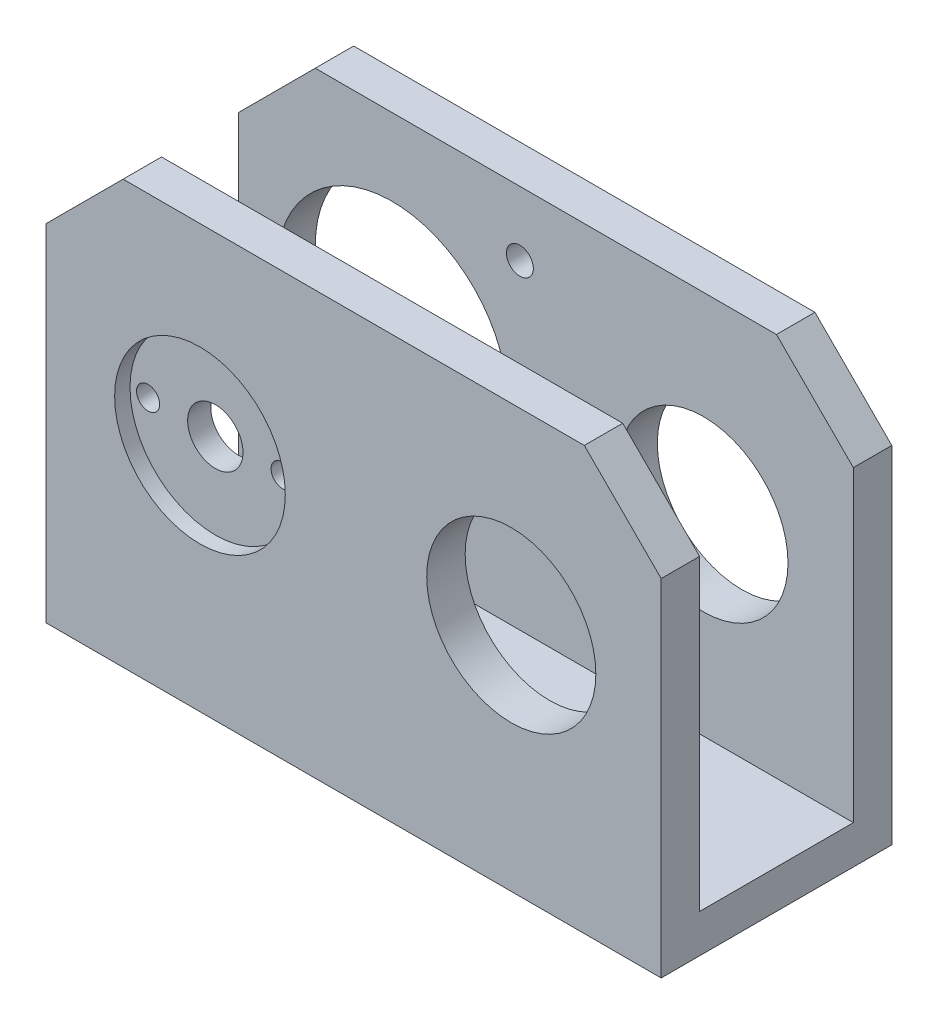
ISO-10303-21;
HEADER;
FILE_DESCRIPTION(('STEP AP214'),'2;1');
FILE_NAME('part.step','',(''),(''),'','','');
FILE_SCHEMA(('AUTOMOTIVE_DESIGN { 1 0 10303 214 1 1 1 1 }'));
ENDSEC;
DATA;
#1=APPLICATION_CONTEXT('core data for automotive mechanical design processes');
#2=APPLICATION_PROTOCOL_DEFINITION('international standard','automotive_design',2000,#1);
#3=PRODUCT_CONTEXT('',#1,'mechanical');
#4=PRODUCT('Part','Part','',(#3));
#5=PRODUCT_RELATED_PRODUCT_CATEGORY('part','',(#4));
#6=PRODUCT_DEFINITION_FORMATION('','',#4);
#7=PRODUCT_DEFINITION_CONTEXT('part definition',#1,'design');
#8=PRODUCT_DEFINITION('design','',#6,#7);
#9=PRODUCT_DEFINITION_SHAPE('','',#8);
#10=(LENGTH_UNIT() NAMED_UNIT(*) SI_UNIT(.MILLI.,.METRE.));
#11=(NAMED_UNIT(*) PLANE_ANGLE_UNIT() SI_UNIT($,.RADIAN.));
#12=(NAMED_UNIT(*) SI_UNIT($,.STERADIAN.) SOLID_ANGLE_UNIT());
#13=UNCERTAINTY_MEASURE_WITH_UNIT(LENGTH_MEASURE(1.E-05),#10,'distance_accuracy_value','');
#14=(GEOMETRIC_REPRESENTATION_CONTEXT(3) GLOBAL_UNCERTAINTY_ASSIGNED_CONTEXT((#13)) GLOBAL_UNIT_ASSIGNED_CONTEXT((#10,
#11,#12)) REPRESENTATION_CONTEXT('',''));
#15=CARTESIAN_POINT('',(0.,0.,0.));
#16=DIRECTION('',(0.,0.,1.));
#17=DIRECTION('',(1.,0.,0.));
#18=AXIS2_PLACEMENT_3D('',#15,#16,#17);
#19=CARTESIAN_POINT('',(0.,-26.,0.));
#20=DIRECTION('',(0.,1.,0.));
#21=DIRECTION('',(0.,0.,1.));
#22=AXIS2_PLACEMENT_3D('',#19,#20,#21);
#23=PLANE('',#22);
#24=DIRECTION('',(0.,0.,1.));
#25=VECTOR('',#24,1.);
#26=CARTESIAN_POINT('',(-40.,-26.,-25.));
#27=LINE('',#26,#25);
#28=CARTESIAN_POINT('',(-40.,-26.,-20.));
#29=VERTEX_POINT('',#28);
#30=CARTESIAN_POINT('',(-40.,-26.,0.));
#31=VERTEX_POINT('',#30);
#32=EDGE_CURVE('E150',#29,#31,#27,.T.);
#33=ORIENTED_EDGE('',*,*,#32,.F.);
#34=DIRECTION('',(1.,0.,0.));
#35=VECTOR('',#34,1.);
#36=CARTESIAN_POINT('',(-120.,-26.,-20.));
#37=LINE('',#36,#35);
#38=CARTESIAN_POINT('',(-120.,-26.,-20.));
#39=VERTEX_POINT('',#38);
#40=EDGE_CURVE('E135',#39,#29,#37,.T.);
#41=ORIENTED_EDGE('',*,*,#40,.F.);
#42=DIRECTION('',(0.,0.,-1.));
#43=VECTOR('',#42,1.);
#44=CARTESIAN_POINT('',(-120.,-26.,-25.));
#45=LINE('',#44,#43);
#46=CARTESIAN_POINT('',(-120.,-26.,0.));
#47=VERTEX_POINT('',#46);
#48=EDGE_CURVE('E149',#47,#39,#45,.T.);
#49=ORIENTED_EDGE('',*,*,#48,.F.);
#50=DIRECTION('',(1.,0.,0.));
#51=VECTOR('',#50,1.);
#52=CARTESIAN_POINT('',(-120.,-26.,0.));
#53=LINE('',#52,#51);
#54=EDGE_CURVE('E213',#47,#31,#53,.T.);
#55=ORIENTED_EDGE('',*,*,#54,.T.);
#56=EDGE_LOOP('',(#33,#41,#49,#55));
#57=FACE_BOUND('',#56,.T.);
#58=ADVANCED_FACE('F39',(#57),#23,.T.);
#59=CARTESIAN_POINT('',(-100.,-1.,0.));
#60=DIRECTION('',(0.,0.,1.));
#61=DIRECTION('',(1.,0.,0.));
#62=AXIS2_PLACEMENT_3D('',#59,#60,#61);
#63=CYLINDRICAL_SURFACE('',#62,3.6);
#64=CARTESIAN_POINT('',(-100.,-1.,0.));
#65=DIRECTION('',(0.,0.,1.));
#66=DIRECTION('',(1.,0.,0.));
#67=AXIS2_PLACEMENT_3D('',#64,#65,#66);
#68=CIRCLE('',#67,3.6);
#69=CARTESIAN_POINT('',(-96.4,-1.,0.));
#70=VERTEX_POINT('',#69);
#71=EDGE_CURVE('E197',#70,#70,#68,.T.);
#72=ORIENTED_EDGE('',*,*,#71,.F.);
#73=EDGE_LOOP('',(#72));
#74=FACE_BOUND('',#73,.T.);
#75=CARTESIAN_POINT('',(-100.,-1.,3.));
#76=DIRECTION('',(0.,0.,1.));
#77=DIRECTION('',(1.,0.,0.));
#78=AXIS2_PLACEMENT_3D('',#75,#76,#77);
#79=CIRCLE('',#78,3.6);
#80=CARTESIAN_POINT('',(-96.4,-1.,3.));
#81=VERTEX_POINT('',#80);
#82=EDGE_CURVE('E190',#81,#81,#79,.F.);
#83=ORIENTED_EDGE('',*,*,#82,.F.);
#84=EDGE_LOOP('',(#83));
#85=FACE_BOUND('',#84,.T.);
#86=ADVANCED_FACE('F308',(#74,#85),#63,.F.);
#87=CARTESIAN_POINT('',(-91.25,-0.999999999999999,0.));
#88=DIRECTION('',(0.,0.,1.));
#89=DIRECTION('',(1.,0.,0.));
#90=AXIS2_PLACEMENT_3D('',#87,#88,#89);
#91=CYLINDRICAL_SURFACE('',#90,1.5);
#92=CARTESIAN_POINT('',(-91.25,-0.999999999999999,0.));
#93=DIRECTION('',(0.,0.,1.));
#94=DIRECTION('',(1.,0.,0.));
#95=AXIS2_PLACEMENT_3D('',#92,#93,#94);
#96=CIRCLE('',#95,1.5);
#97=CARTESIAN_POINT('',(-89.75,-0.999999999999999,0.));
#98=VERTEX_POINT('',#97);
#99=EDGE_CURVE('E193',#98,#98,#96,.T.);
#100=ORIENTED_EDGE('',*,*,#99,.F.);
#101=EDGE_LOOP('',(#100));
#102=FACE_BOUND('',#101,.T.);
#103=CARTESIAN_POINT('',(-91.25,-0.999999999999999,3.));
#104=DIRECTION('',(0.,0.,1.));
#105=DIRECTION('',(1.,0.,0.));
#106=AXIS2_PLACEMENT_3D('',#103,#104,#105);
#107=CIRCLE('',#106,1.5);
#108=CARTESIAN_POINT('',(-89.75,-0.999999999999999,3.));
#109=VERTEX_POINT('',#108);
#110=EDGE_CURVE('E187',#109,#109,#107,.F.);
#111=ORIENTED_EDGE('',*,*,#110,.F.);
#112=EDGE_LOOP('',(#111));
#113=FACE_BOUND('',#112,.T.);
#114=ADVANCED_FACE('F313',(#102,#113),#91,.F.);
#115=CARTESIAN_POINT('',(-108.75,-1.,0.));
#116=DIRECTION('',(0.,0.,1.));
#117=DIRECTION('',(1.,0.,0.));
#118=AXIS2_PLACEMENT_3D('',#115,#116,#117);
#119=CYLINDRICAL_SURFACE('',#118,1.5);
#120=CARTESIAN_POINT('',(-108.75,-1.,0.));
#121=DIRECTION('',(0.,0.,1.));
#122=DIRECTION('',(1.,0.,0.));
#123=AXIS2_PLACEMENT_3D('',#120,#121,#122);
#124=CIRCLE('',#123,1.5);
#125=CARTESIAN_POINT('',(-107.25,-1.,0.));
#126=VERTEX_POINT('',#125);
#127=EDGE_CURVE('E194',#126,#126,#124,.T.);
#128=ORIENTED_EDGE('',*,*,#127,.F.);
#129=EDGE_LOOP('',(#128));
#130=FACE_BOUND('',#129,.T.);
#131=CARTESIAN_POINT('',(-108.75,-1.,3.));
#132=DIRECTION('',(0.,0.,1.));
#133=DIRECTION('',(1.,0.,0.));
#134=AXIS2_PLACEMENT_3D('',#131,#132,#133);
#135=CIRCLE('',#134,1.5);
#136=CARTESIAN_POINT('',(-107.25,-1.,3.));
#137=VERTEX_POINT('',#136);
#138=EDGE_CURVE('E184',#137,#137,#135,.F.);
#139=ORIENTED_EDGE('',*,*,#138,.F.);
#140=EDGE_LOOP('',(#139));
#141=FACE_BOUND('',#140,.T.);
#142=ADVANCED_FACE('F334',(#130,#141),#119,.F.);
#143=CARTESIAN_POINT('',(-120.,24.,5.));
#144=DIRECTION('',(1.,0.,0.));
#145=DIRECTION('',(0.,0.,-1.));
#146=AXIS2_PLACEMENT_3D('',#143,#144,#145);
#147=PLANE('',#146);
#148=DIRECTION('',(0.,-1.,0.));
#149=VECTOR('',#148,1.);
#150=CARTESIAN_POINT('',(-120.,24.,5.));
#151=LINE('',#150,#149);
#152=CARTESIAN_POINT('',(-120.,14.,5.));
#153=VERTEX_POINT('',#152);
#154=CARTESIAN_POINT('',(-120.,-31.,5.));
#155=VERTEX_POINT('',#154);
#156=EDGE_CURVE('E202',#153,#155,#151,.T.);
#157=ORIENTED_EDGE('',*,*,#156,.F.);
#158=DIRECTION('',(0.,0.,-1.));
#159=VECTOR('',#158,1.);
#160=CARTESIAN_POINT('',(-120.,14.,5.));
#161=LINE('',#160,#159);
#162=CARTESIAN_POINT('',(-120.,14.,0.));
#163=VERTEX_POINT('',#162);
#164=EDGE_CURVE('E228',#153,#163,#161,.T.);
#165=ORIENTED_EDGE('',*,*,#164,.T.);
#166=DIRECTION('',(0.,-1.,0.));
#167=VECTOR('',#166,1.);
#168=CARTESIAN_POINT('',(-120.,24.,0.));
#169=LINE('',#168,#167);
#170=EDGE_CURVE('E157',#163,#47,#169,.T.);
#171=ORIENTED_EDGE('',*,*,#170,.T.);
#172=ORIENTED_EDGE('',*,*,#48,.T.);
#173=DIRECTION('',(0.,-1.,0.));
#174=VECTOR('',#173,1.);
#175=CARTESIAN_POINT('',(-120.,104.156097709407,-20.));
#176=LINE('',#175,#174);
#177=CARTESIAN_POINT('',(-120.,14.,-20.));
#178=VERTEX_POINT('',#177);
#179=EDGE_CURVE('E131',#178,#39,#176,.T.);
#180=ORIENTED_EDGE('',*,*,#179,.F.);
#181=DIRECTION('',(0.,0.,-1.));
#182=VECTOR('',#181,1.);
#183=CARTESIAN_POINT('',(-120.,14.,5.));
#184=LINE('',#183,#182);
#185=CARTESIAN_POINT('',(-120.,14.,-25.));
#186=VERTEX_POINT('',#185);
#187=EDGE_CURVE('E211',#178,#186,#184,.T.);
#188=ORIENTED_EDGE('',*,*,#187,.T.);
#189=DIRECTION('',(0.,1.,0.));
#190=VECTOR('',#189,1.);
#191=CARTESIAN_POINT('',(-120.,-31.,-25.));
#192=LINE('',#191,#190);
#193=CARTESIAN_POINT('',(-120.,-31.,-25.));
#194=VERTEX_POINT('',#193);
#195=EDGE_CURVE('E171',#194,#186,#192,.T.);
#196=ORIENTED_EDGE('',*,*,#195,.F.);
#197=DIRECTION('',(0.,0.,-1.));
#198=VECTOR('',#197,1.);
#199=CARTESIAN_POINT('',(-120.,-31.,-25.));
#200=LINE('',#199,#198);
#201=EDGE_CURVE('E161',#155,#194,#200,.T.);
#202=ORIENTED_EDGE('',*,*,#201,.F.);
#203=EDGE_LOOP('',(#157,#165,#171,#172,#180,#188,#196,#202));
#204=FACE_BOUND('',#203,.T.);
#205=ADVANCED_FACE('F154',(#204),#147,.F.);
#206=CARTESIAN_POINT('',(-40.,24.,5.));
#207=DIRECTION('',(-1.,0.,0.));
#208=DIRECTION('',(0.,-1.,0.));
#209=AXIS2_PLACEMENT_3D('',#206,#207,#208);
#210=PLANE('',#209);
#211=DIRECTION('',(0.,1.,0.));
#212=VECTOR('',#211,1.);
#213=CARTESIAN_POINT('',(-40.,24.,0.));
#214=LINE('',#213,#212);
#215=CARTESIAN_POINT('',(-40.,14.,0.));
#216=VERTEX_POINT('',#215);
#217=EDGE_CURVE('E215',#31,#216,#214,.T.);
#218=ORIENTED_EDGE('',*,*,#217,.T.);
#219=DIRECTION('',(0.,0.,1.));
#220=VECTOR('',#219,1.);
#221=CARTESIAN_POINT('',(-40.,14.,5.));
#222=LINE('',#221,#220);
#223=CARTESIAN_POINT('',(-40.,14.,5.));
#224=VERTEX_POINT('',#223);
#225=EDGE_CURVE('E11',#216,#224,#222,.T.);
#226=ORIENTED_EDGE('',*,*,#225,.T.);
#227=DIRECTION('',(0.,1.,0.));
#228=VECTOR('',#227,1.);
#229=CARTESIAN_POINT('',(-40.,24.,5.));
#230=LINE('',#229,#228);
#231=CARTESIAN_POINT('',(-40.,-31.,5.));
#232=VERTEX_POINT('',#231);
#233=EDGE_CURVE('E204',#232,#224,#230,.T.);
#234=ORIENTED_EDGE('',*,*,#233,.F.);
#235=DIRECTION('',(0.,0.,1.));
#236=VECTOR('',#235,1.);
#237=CARTESIAN_POINT('',(-40.,-31.,-25.));
#238=LINE('',#237,#236);
#239=CARTESIAN_POINT('',(-40.,-31.,-25.));
#240=VERTEX_POINT('',#239);
#241=EDGE_CURVE('E263',#240,#232,#238,.T.);
#242=ORIENTED_EDGE('',*,*,#241,.F.);
#243=DIRECTION('',(0.,1.,0.));
#244=VECTOR('',#243,1.);
#245=CARTESIAN_POINT('',(-40.,-31.,-25.));
#246=LINE('',#245,#244);
#247=CARTESIAN_POINT('',(-40.,14.,-25.));
#248=VERTEX_POINT('',#247);
#249=EDGE_CURVE('E168',#240,#248,#246,.T.);
#250=ORIENTED_EDGE('',*,*,#249,.T.);
#251=DIRECTION('',(0.,0.,1.));
#252=VECTOR('',#251,1.);
#253=CARTESIAN_POINT('',(-40.,14.,5.));
#254=LINE('',#253,#252);
#255=CARTESIAN_POINT('',(-40.,14.,-20.));
#256=VERTEX_POINT('',#255);
#257=EDGE_CURVE('E48',#248,#256,#254,.T.);
#258=ORIENTED_EDGE('',*,*,#257,.T.);
#259=DIRECTION('',(0.,-1.,0.));
#260=VECTOR('',#259,1.);
#261=CARTESIAN_POINT('',(-40.,104.156097709407,-20.));
#262=LINE('',#261,#260);
#263=EDGE_CURVE('E144',#256,#29,#262,.T.);
#264=ORIENTED_EDGE('',*,*,#263,.T.);
#265=ORIENTED_EDGE('',*,*,#32,.T.);
#266=EDGE_LOOP('',(#218,#226,#234,#242,#250,#258,#264,#265));
#267=FACE_BOUND('',#266,.T.);
#268=ADVANCED_FACE('F252',(#267),#210,.F.);
#269=CARTESIAN_POINT('',(-120.,24.,5.));
#270=DIRECTION('',(0.,-1.,0.));
#271=DIRECTION('',(0.,0.,-1.));
#272=AXIS2_PLACEMENT_3D('',#269,#270,#271);
#273=PLANE('',#272);
#274=DIRECTION('',(-1.,0.,0.));
#275=VECTOR('',#274,1.);
#276=CARTESIAN_POINT('',(-120.,24.,0.));
#277=LINE('',#276,#275);
#278=CARTESIAN_POINT('',(-50.,24.,0.));
#279=VERTEX_POINT('',#278);
#280=CARTESIAN_POINT('',(-110.,24.,0.));
#281=VERTEX_POINT('',#280);
#282=EDGE_CURVE('E205',#279,#281,#277,.T.);
#283=ORIENTED_EDGE('',*,*,#282,.T.);
#284=DIRECTION('',(0.,0.,1.));
#285=VECTOR('',#284,1.);
#286=CARTESIAN_POINT('',(-110.,24.,5.));
#287=LINE('',#286,#285);
#288=CARTESIAN_POINT('',(-110.,24.,5.));
#289=VERTEX_POINT('',#288);
#290=EDGE_CURVE('E237',#281,#289,#287,.T.);
#291=ORIENTED_EDGE('',*,*,#290,.T.);
#292=DIRECTION('',(-1.,0.,0.));
#293=VECTOR('',#292,1.);
#294=CARTESIAN_POINT('',(-120.,24.,5.));
#295=LINE('',#294,#293);
#296=CARTESIAN_POINT('',(-50.,24.,5.));
#297=VERTEX_POINT('',#296);
#298=EDGE_CURVE('E208',#297,#289,#295,.T.);
#299=ORIENTED_EDGE('',*,*,#298,.F.);
#300=DIRECTION('',(0.,0.,-1.));
#301=VECTOR('',#300,1.);
#302=CARTESIAN_POINT('',(-50.,24.,5.));
#303=LINE('',#302,#301);
#304=EDGE_CURVE('E234',#297,#279,#303,.T.);
#305=ORIENTED_EDGE('',*,*,#304,.T.);
#306=EDGE_LOOP('',(#283,#291,#299,#305));
#307=FACE_BOUND('',#306,.T.);
#308=ADVANCED_FACE('F284',(#307),#273,.F.);
#309=CARTESIAN_POINT('',(0.,0.,5.));
#310=DIRECTION('',(0.,0.,1.));
#311=DIRECTION('',(1.,0.,0.));
#312=AXIS2_PLACEMENT_3D('',#309,#310,#311);
#313=PLANE('',#312);
#314=CARTESIAN_POINT('',(-59.5,-1.,5.));
#315=DIRECTION('',(0.,0.,1.));
#316=DIRECTION('',(1.,0.,0.));
#317=AXIS2_PLACEMENT_3D('',#314,#315,#316);
#318=CIRCLE('',#317,11.);
#319=CARTESIAN_POINT('',(-48.5,-1.,5.));
#320=VERTEX_POINT('',#319);
#321=EDGE_CURVE('E174',#320,#320,#318,.T.);
#322=ORIENTED_EDGE('',*,*,#321,.F.);
#323=EDGE_LOOP('',(#322));
#324=FACE_BOUND('',#323,.T.);
#325=CARTESIAN_POINT('',(-100.,-1.,5.));
#326=DIRECTION('',(0.,0.,1.));
#327=DIRECTION('',(1.,0.,0.));
#328=AXIS2_PLACEMENT_3D('',#325,#326,#327);
#329=CIRCLE('',#328,11.1);
#330=CARTESIAN_POINT('',(-88.9,-1.,5.));
#331=VERTEX_POINT('',#330);
#332=EDGE_CURVE('E178',#331,#331,#329,.T.);
#333=ORIENTED_EDGE('',*,*,#332,.F.);
#334=EDGE_LOOP('',(#333));
#335=FACE_BOUND('',#334,.T.);
#336=ORIENTED_EDGE('',*,*,#298,.T.);
#337=DIRECTION('',(0.707106781186549,0.707106781186547,0.));
#338=VECTOR('',#337,1.);
#339=CARTESIAN_POINT('',(-66.9999999999998,67.,5.));
#340=LINE('',#339,#338);
#341=EDGE_CURVE('E241',#289,#153,#340,.F.);
#342=ORIENTED_EDGE('',*,*,#341,.T.);
#343=ORIENTED_EDGE('',*,*,#156,.T.);
#344=DIRECTION('',(-1.,0.,0.));
#345=VECTOR('',#344,1.);
#346=CARTESIAN_POINT('',(-120.,-31.,5.));
#347=LINE('',#346,#345);
#348=EDGE_CURVE('E165',#232,#155,#347,.T.);
#349=ORIENTED_EDGE('',*,*,#348,.F.);
#350=ORIENTED_EDGE('',*,*,#233,.T.);
#351=DIRECTION('',(0.707106781186547,-0.707106781186549,0.));
#352=VECTOR('',#351,1.);
#353=CARTESIAN_POINT('',(-13.0000000000001,-13.,5.));
#354=LINE('',#353,#352);
#355=EDGE_CURVE('E239',#224,#297,#354,.F.);
#356=ORIENTED_EDGE('',*,*,#355,.T.);
#357=EDGE_LOOP('',(#336,#342,#343,#349,#350,#356));
#358=FACE_BOUND('',#357,.T.);
#359=ADVANCED_FACE('F277',(#324,#335,#358),#313,.T.);
#360=CARTESIAN_POINT('',(0.,0.,0.));
#361=DIRECTION('',(0.,0.,1.));
#362=DIRECTION('',(1.,0.,0.));
#363=AXIS2_PLACEMENT_3D('',#360,#361,#362);
#364=PLANE('',#363);
#365=CARTESIAN_POINT('',(-59.5,-1.,0.));
#366=DIRECTION('',(0.,0.,1.));
#367=DIRECTION('',(1.,0.,0.));
#368=AXIS2_PLACEMENT_3D('',#365,#366,#367);
#369=CIRCLE('',#368,11.);
#370=CARTESIAN_POINT('',(-48.5,-1.,0.));
#371=VERTEX_POINT('',#370);
#372=EDGE_CURVE('E175',#371,#371,#369,.T.);
#373=ORIENTED_EDGE('',*,*,#372,.T.);
#374=EDGE_LOOP('',(#373));
#375=FACE_BOUND('',#374,.T.);
#376=ORIENTED_EDGE('',*,*,#127,.T.);
#377=EDGE_LOOP('',(#376));
#378=FACE_BOUND('',#377,.T.);
#379=ORIENTED_EDGE('',*,*,#99,.T.);
#380=EDGE_LOOP('',(#379));
#381=FACE_BOUND('',#380,.T.);
#382=ORIENTED_EDGE('',*,*,#71,.T.);
#383=EDGE_LOOP('',(#382));
#384=FACE_BOUND('',#383,.T.);
#385=ORIENTED_EDGE('',*,*,#170,.F.);
#386=DIRECTION('',(-0.707106781186549,-0.707106781186547,0.));
#387=VECTOR('',#386,1.);
#388=CARTESIAN_POINT('',(-120.,14.,0.));
#389=LINE('',#388,#387);
#390=EDGE_CURVE('E232',#163,#281,#389,.F.);
#391=ORIENTED_EDGE('',*,*,#390,.T.);
#392=ORIENTED_EDGE('',*,*,#282,.F.);
#393=DIRECTION('',(-0.707106781186547,0.707106781186549,0.));
#394=VECTOR('',#393,1.);
#395=CARTESIAN_POINT('',(-50.,24.,0.));
#396=LINE('',#395,#394);
#397=EDGE_CURVE('E230',#279,#216,#396,.F.);
#398=ORIENTED_EDGE('',*,*,#397,.T.);
#399=ORIENTED_EDGE('',*,*,#217,.F.);
#400=ORIENTED_EDGE('',*,*,#54,.F.);
#401=EDGE_LOOP('',(#385,#391,#392,#398,#399,#400));
#402=FACE_BOUND('',#401,.T.);
#403=ADVANCED_FACE('F287',(#375,#378,#381,#384,#402),#364,.F.);
#404=CARTESIAN_POINT('',(-100.,-1.,3.));
#405=DIRECTION('',(0.,0.,1.));
#406=DIRECTION('',(1.,0.,0.));
#407=AXIS2_PLACEMENT_3D('',#404,#405,#406);
#408=PLANE('',#407);
#409=CARTESIAN_POINT('',(-100.,-1.,3.));
#410=DIRECTION('',(0.,0.,1.));
#411=DIRECTION('',(1.,0.,0.));
#412=AXIS2_PLACEMENT_3D('',#409,#410,#411);
#413=CIRCLE('',#412,11.1);
#414=CARTESIAN_POINT('',(-88.9,-1.,3.));
#415=VERTEX_POINT('',#414);
#416=EDGE_CURVE('E181',#415,#415,#413,.T.);
#417=ORIENTED_EDGE('',*,*,#416,.T.);
#418=EDGE_LOOP('',(#417));
#419=FACE_BOUND('',#418,.T.);
#420=ORIENTED_EDGE('',*,*,#138,.T.);
#421=EDGE_LOOP('',(#420));
#422=FACE_BOUND('',#421,.T.);
#423=ORIENTED_EDGE('',*,*,#110,.T.);
#424=EDGE_LOOP('',(#423));
#425=FACE_BOUND('',#424,.T.);
#426=ORIENTED_EDGE('',*,*,#82,.T.);
#427=EDGE_LOOP('',(#426));
#428=FACE_BOUND('',#427,.T.);
#429=ADVANCED_FACE('F327',(#419,#422,#425,#428),#408,.T.);
#430=CARTESIAN_POINT('',(-100.,-1.,3.));
#431=DIRECTION('',(0.,0.,1.));
#432=DIRECTION('',(1.,0.,0.));
#433=AXIS2_PLACEMENT_3D('',#430,#431,#432);
#434=CYLINDRICAL_SURFACE('',#433,11.1);
#435=ORIENTED_EDGE('',*,*,#416,.F.);
#436=EDGE_LOOP('',(#435));
#437=FACE_BOUND('',#436,.T.);
#438=ORIENTED_EDGE('',*,*,#332,.T.);
#439=EDGE_LOOP('',(#438));
#440=FACE_BOUND('',#439,.T.);
#441=ADVANCED_FACE('F325',(#437,#440),#434,.F.);
#442=CARTESIAN_POINT('',(-59.5,-1.,0.));
#443=DIRECTION('',(0.,0.,1.));
#444=DIRECTION('',(1.,0.,0.));
#445=AXIS2_PLACEMENT_3D('',#442,#443,#444);
#446=CYLINDRICAL_SURFACE('',#445,11.);
#447=ORIENTED_EDGE('',*,*,#372,.F.);
#448=EDGE_LOOP('',(#447));
#449=FACE_BOUND('',#448,.T.);
#450=ORIENTED_EDGE('',*,*,#321,.T.);
#451=EDGE_LOOP('',(#450));
#452=FACE_BOUND('',#451,.T.);
#453=ADVANCED_FACE('F321',(#449,#452),#446,.F.);
#454=CARTESIAN_POINT('',(-120.,-31.,-25.));
#455=DIRECTION('',(0.,0.,1.));
#456=DIRECTION('',(1.,0.,0.));
#457=AXIS2_PLACEMENT_3D('',#454,#455,#456);
#458=PLANE('',#457);
#459=CARTESIAN_POINT('',(-59.5,-1.,-25.));
#460=DIRECTION('',(0.,0.,1.));
#461=DIRECTION('',(1.,0.,0.));
#462=AXIS2_PLACEMENT_3D('',#459,#460,#461);
#463=CIRCLE('',#462,11.);
#464=CARTESIAN_POINT('',(-48.5,-1.,-25.));
#465=VERTEX_POINT('',#464);
#466=EDGE_CURVE('E226',#465,#465,#463,.T.);
#467=ORIENTED_EDGE('',*,*,#466,.T.);
#468=EDGE_LOOP('',(#467));
#469=FACE_BOUND('',#468,.T.);
#470=CARTESIAN_POINT('',(-116.617009357884,-17.6170093578839,-25.));
#471=DIRECTION('',(0.,0.,-1.));
#472=DIRECTION('',(-1.,0.,0.));
#473=AXIS2_PLACEMENT_3D('',#470,#471,#472);
#474=CIRCLE('',#473,1.75);
#475=CARTESIAN_POINT('',(-118.367009357884,-17.6170093578839,-25.));
#476=VERTEX_POINT('',#475);
#477=EDGE_CURVE('E589',#476,#476,#474,.T.);
#478=ORIENTED_EDGE('',*,*,#477,.F.);
#479=EDGE_LOOP('',(#478));
#480=FACE_BOUND('',#479,.T.);
#481=CARTESIAN_POINT('',(-83.3829906421162,15.6170093578839,-25.));
#482=DIRECTION('',(0.,0.,-1.));
#483=DIRECTION('',(-1.,0.,0.));
#484=AXIS2_PLACEMENT_3D('',#481,#482,#483);
#485=CIRCLE('',#484,1.75);
#486=CARTESIAN_POINT('',(-85.1329906421162,15.6170093578839,-25.));
#487=VERTEX_POINT('',#486);
#488=EDGE_CURVE('E225',#487,#487,#485,.T.);
#489=ORIENTED_EDGE('',*,*,#488,.F.);
#490=EDGE_LOOP('',(#489));
#491=FACE_BOUND('',#490,.T.);
#492=CARTESIAN_POINT('',(-100.,-1.,-25.));
#493=DIRECTION('',(0.,0.,-1.));
#494=DIRECTION('',(-1.,0.,0.));
#495=AXIS2_PLACEMENT_3D('',#492,#493,#494);
#496=CIRCLE('',#495,15.);
#497=CARTESIAN_POINT('',(-115.,-1.,-25.));
#498=VERTEX_POINT('',#497);
#499=EDGE_CURVE('E596',#498,#498,#496,.T.);
#500=ORIENTED_EDGE('',*,*,#499,.F.);
#501=EDGE_LOOP('',(#500));
#502=FACE_BOUND('',#501,.T.);
#503=ORIENTED_EDGE('',*,*,#195,.T.);
#504=DIRECTION('',(-0.707106781186549,-0.707106781186547,0.));
#505=VECTOR('',#504,1.);
#506=CARTESIAN_POINT('',(-120.,14.,-25.));
#507=LINE('',#506,#505);
#508=CARTESIAN_POINT('',(-110.,24.,-25.));
#509=VERTEX_POINT('',#508);
#510=EDGE_CURVE('E245',#186,#509,#507,.F.);
#511=ORIENTED_EDGE('',*,*,#510,.T.);
#512=DIRECTION('',(1.,0.,0.));
#513=VECTOR('',#512,1.);
#514=CARTESIAN_POINT('',(-120.,24.,-25.));
#515=LINE('',#514,#513);
#516=CARTESIAN_POINT('',(-50.0000000000001,24.,-25.));
#517=VERTEX_POINT('',#516);
#518=EDGE_CURVE('E143',#509,#517,#515,.T.);
#519=ORIENTED_EDGE('',*,*,#518,.T.);
#520=DIRECTION('',(-0.707106781186549,0.707106781186546,0.));
#521=VECTOR('',#520,1.);
#522=CARTESIAN_POINT('',(-40.,14.,-25.));
#523=LINE('',#522,#521);
#524=EDGE_CURVE('E243',#517,#248,#523,.F.);
#525=ORIENTED_EDGE('',*,*,#524,.T.);
#526=ORIENTED_EDGE('',*,*,#249,.F.);
#527=DIRECTION('',(1.,0.,0.));
#528=VECTOR('',#527,1.);
#529=CARTESIAN_POINT('',(-120.,-31.,-25.));
#530=LINE('',#529,#528);
#531=EDGE_CURVE('E262',#194,#240,#530,.T.);
#532=ORIENTED_EDGE('',*,*,#531,.F.);
#533=EDGE_LOOP('',(#503,#511,#519,#525,#526,#532));
#534=FACE_BOUND('',#533,.T.);
#535=ADVANCED_FACE('F274',(#469,#480,#491,#502,#534),#458,.F.);
#536=CARTESIAN_POINT('',(0.,-31.,0.));
#537=DIRECTION('',(0.,1.,0.));
#538=DIRECTION('',(0.,0.,1.));
#539=AXIS2_PLACEMENT_3D('',#536,#537,#538);
#540=PLANE('',#539);
#541=ORIENTED_EDGE('',*,*,#201,.T.);
#542=ORIENTED_EDGE('',*,*,#531,.T.);
#543=ORIENTED_EDGE('',*,*,#241,.T.);
#544=ORIENTED_EDGE('',*,*,#348,.T.);
#545=EDGE_LOOP('',(#541,#542,#543,#544));
#546=FACE_BOUND('',#545,.T.);
#547=ADVANCED_FACE('F269',(#546),#540,.F.);
#548=CARTESIAN_POINT('',(-120.,104.156097709407,-20.));
#549=DIRECTION('',(0.,0.,-1.));
#550=DIRECTION('',(-1.,0.,0.));
#551=AXIS2_PLACEMENT_3D('',#548,#549,#550);
#552=PLANE('',#551);
#553=CARTESIAN_POINT('',(-59.5,-1.,-20.));
#554=DIRECTION('',(0.,0.,-1.));
#555=DIRECTION('',(-1.,0.,0.));
#556=AXIS2_PLACEMENT_3D('',#553,#554,#555);
#557=CIRCLE('',#556,11.);
#558=CARTESIAN_POINT('',(-70.5,-1.,-20.));
#559=VERTEX_POINT('',#558);
#560=EDGE_CURVE('E222',#559,#559,#557,.F.);
#561=ORIENTED_EDGE('',*,*,#560,.F.);
#562=EDGE_LOOP('',(#561));
#563=FACE_BOUND('',#562,.T.);
#564=CARTESIAN_POINT('',(-116.617009357884,-17.6170093578839,-20.));
#565=DIRECTION('',(0.,0.,-1.));
#566=DIRECTION('',(-1.,0.,0.));
#567=AXIS2_PLACEMENT_3D('',#564,#565,#566);
#568=CIRCLE('',#567,1.75);
#569=CARTESIAN_POINT('',(-118.367009357884,-17.6170093578839,-20.));
#570=VERTEX_POINT('',#569);
#571=EDGE_CURVE('E592',#570,#570,#568,.F.);
#572=ORIENTED_EDGE('',*,*,#571,.F.);
#573=EDGE_LOOP('',(#572));
#574=FACE_BOUND('',#573,.T.);
#575=CARTESIAN_POINT('',(-83.3829906421162,15.6170093578839,-20.));
#576=DIRECTION('',(0.,0.,-1.));
#577=DIRECTION('',(-1.,0.,0.));
#578=AXIS2_PLACEMENT_3D('',#575,#576,#577);
#579=CIRCLE('',#578,1.75);
#580=CARTESIAN_POINT('',(-85.1329906421162,15.6170093578839,-20.));
#581=VERTEX_POINT('',#580);
#582=EDGE_CURVE('E594',#581,#581,#579,.F.);
#583=ORIENTED_EDGE('',*,*,#582,.F.);
#584=EDGE_LOOP('',(#583));
#585=FACE_BOUND('',#584,.T.);
#586=CARTESIAN_POINT('',(-100.,-1.,-20.));
#587=DIRECTION('',(0.,0.,-1.));
#588=DIRECTION('',(-1.,0.,0.));
#589=AXIS2_PLACEMENT_3D('',#586,#587,#588);
#590=CIRCLE('',#589,15.);
#591=CARTESIAN_POINT('',(-115.,-1.,-20.));
#592=VERTEX_POINT('',#591);
#593=EDGE_CURVE('E151',#592,#592,#590,.F.);
#594=ORIENTED_EDGE('',*,*,#593,.F.);
#595=EDGE_LOOP('',(#594));
#596=FACE_BOUND('',#595,.T.);
#597=DIRECTION('',(-1.,0.,0.));
#598=VECTOR('',#597,1.);
#599=CARTESIAN_POINT('',(-120.,24.,-20.));
#600=LINE('',#599,#598);
#601=CARTESIAN_POINT('',(-50.0000000000001,24.,-20.));
#602=VERTEX_POINT('',#601);
#603=CARTESIAN_POINT('',(-110.,24.,-20.));
#604=VERTEX_POINT('',#603);
#605=EDGE_CURVE('E159',#602,#604,#600,.T.);
#606=ORIENTED_EDGE('',*,*,#605,.T.);
#607=DIRECTION('',(0.707106781186549,0.707106781186547,0.));
#608=VECTOR('',#607,1.);
#609=CARTESIAN_POINT('',(-120.,14.,-20.));
#610=LINE('',#609,#608);
#611=EDGE_CURVE('E138',#604,#178,#610,.F.);
#612=ORIENTED_EDGE('',*,*,#611,.T.);
#613=ORIENTED_EDGE('',*,*,#179,.T.);
#614=ORIENTED_EDGE('',*,*,#40,.T.);
#615=ORIENTED_EDGE('',*,*,#263,.F.);
#616=DIRECTION('',(0.707106781186549,-0.707106781186546,0.));
#617=VECTOR('',#616,1.);
#618=CARTESIAN_POINT('',(-40.,14.,-20.));
#619=LINE('',#618,#617);
#620=EDGE_CURVE('E55',#256,#602,#619,.F.);
#621=ORIENTED_EDGE('',*,*,#620,.T.);
#622=EDGE_LOOP('',(#606,#612,#613,#614,#615,#621));
#623=FACE_BOUND('',#622,.T.);
#624=ADVANCED_FACE('F133',(#563,#574,#585,#596,#623),#552,.F.);
#625=CARTESIAN_POINT('',(-120.,24.,5.));
#626=DIRECTION('',(0.,-1.,0.));
#627=DIRECTION('',(0.,0.,-1.));
#628=AXIS2_PLACEMENT_3D('',#625,#626,#627);
#629=PLANE('',#628);
#630=ORIENTED_EDGE('',*,*,#518,.F.);
#631=DIRECTION('',(0.,0.,1.));
#632=VECTOR('',#631,1.);
#633=CARTESIAN_POINT('',(-110.,24.,5.));
#634=LINE('',#633,#632);
#635=EDGE_CURVE('E63',#509,#604,#634,.T.);
#636=ORIENTED_EDGE('',*,*,#635,.T.);
#637=ORIENTED_EDGE('',*,*,#605,.F.);
#638=DIRECTION('',(0.,0.,-1.));
#639=VECTOR('',#638,1.);
#640=CARTESIAN_POINT('',(-50.0000000000001,24.,5.));
#641=LINE('',#640,#639);
#642=EDGE_CURVE('E247',#602,#517,#641,.T.);
#643=ORIENTED_EDGE('',*,*,#642,.T.);
#644=EDGE_LOOP('',(#630,#636,#637,#643));
#645=FACE_BOUND('',#644,.T.);
#646=ADVANCED_FACE('F399',(#645),#629,.F.);
#647=CARTESIAN_POINT('',(-100.,-1.,5.001));
#648=DIRECTION('',(0.,0.,-1.));
#649=DIRECTION('',(-1.,0.,0.));
#650=AXIS2_PLACEMENT_3D('',#647,#648,#649);
#651=CYLINDRICAL_SURFACE('',#650,15.);
#652=ORIENTED_EDGE('',*,*,#499,.T.);
#653=EDGE_LOOP('',(#652));
#654=FACE_BOUND('',#653,.T.);
#655=ORIENTED_EDGE('',*,*,#593,.T.);
#656=EDGE_LOOP('',(#655));
#657=FACE_BOUND('',#656,.T.);
#658=ADVANCED_FACE('F406',(#654,#657),#651,.F.);
#659=CARTESIAN_POINT('',(-83.3829906421162,15.6170093578839,5.001));
#660=DIRECTION('',(0.,0.,-1.));
#661=DIRECTION('',(-1.,0.,0.));
#662=AXIS2_PLACEMENT_3D('',#659,#660,#661);
#663=CYLINDRICAL_SURFACE('',#662,1.75);
#664=ORIENTED_EDGE('',*,*,#488,.T.);
#665=EDGE_LOOP('',(#664));
#666=FACE_BOUND('',#665,.T.);
#667=ORIENTED_EDGE('',*,*,#582,.T.);
#668=EDGE_LOOP('',(#667));
#669=FACE_BOUND('',#668,.T.);
#670=ADVANCED_FACE('F413',(#666,#669),#663,.F.);
#671=CARTESIAN_POINT('',(-116.617009357884,-17.6170093578839,5.001));
#672=DIRECTION('',(0.,0.,-1.));
#673=DIRECTION('',(-1.,0.,0.));
#674=AXIS2_PLACEMENT_3D('',#671,#672,#673);
#675=CYLINDRICAL_SURFACE('',#674,1.75);
#676=ORIENTED_EDGE('',*,*,#477,.T.);
#677=EDGE_LOOP('',(#676));
#678=FACE_BOUND('',#677,.T.);
#679=ORIENTED_EDGE('',*,*,#571,.T.);
#680=EDGE_LOOP('',(#679));
#681=FACE_BOUND('',#680,.T.);
#682=ADVANCED_FACE('F302',(#678,#681),#675,.F.);
#683=CARTESIAN_POINT('',(-59.5,-1.,5.));
#684=DIRECTION('',(0.,0.,-1.));
#685=DIRECTION('',(-1.,0.,0.));
#686=AXIS2_PLACEMENT_3D('',#683,#684,#685);
#687=CYLINDRICAL_SURFACE('',#686,11.);
#688=ORIENTED_EDGE('',*,*,#466,.F.);
#689=EDGE_LOOP('',(#688));
#690=FACE_BOUND('',#689,.T.);
#691=ORIENTED_EDGE('',*,*,#560,.T.);
#692=EDGE_LOOP('',(#691));
#693=FACE_BOUND('',#692,.T.);
#694=ADVANCED_FACE('F294',(#690,#693),#687,.F.);
#695=CARTESIAN_POINT('',(-120.,14.,5.));
#696=DIRECTION('',(0.707106781186547,-0.707106781186549,0.));
#697=DIRECTION('',(0.,0.,-1.));
#698=AXIS2_PLACEMENT_3D('',#695,#696,#697);
#699=PLANE('',#698);
#700=ORIENTED_EDGE('',*,*,#341,.F.);
#701=ORIENTED_EDGE('',*,*,#290,.F.);
#702=ORIENTED_EDGE('',*,*,#390,.F.);
#703=ORIENTED_EDGE('',*,*,#164,.F.);
#704=EDGE_LOOP('',(#700,#701,#702,#703));
#705=FACE_BOUND('',#704,.T.);
#706=ADVANCED_FACE('F291',(#705),#699,.F.);
#707=CARTESIAN_POINT('',(-120.,14.,5.));
#708=DIRECTION('',(0.707106781186547,-0.707106781186549,0.));
#709=DIRECTION('',(0.,0.,-1.));
#710=AXIS2_PLACEMENT_3D('',#707,#708,#709);
#711=PLANE('',#710);
#712=ORIENTED_EDGE('',*,*,#611,.F.);
#713=ORIENTED_EDGE('',*,*,#635,.F.);
#714=ORIENTED_EDGE('',*,*,#510,.F.);
#715=ORIENTED_EDGE('',*,*,#187,.F.);
#716=EDGE_LOOP('',(#712,#713,#714,#715));
#717=FACE_BOUND('',#716,.T.);
#718=ADVANCED_FACE('F293',(#717),#711,.F.);
#719=CARTESIAN_POINT('',(-50.,24.,5.));
#720=DIRECTION('',(-0.707106781186549,-0.707106781186547,0.));
#721=DIRECTION('',(0.,0.,-1.));
#722=AXIS2_PLACEMENT_3D('',#719,#720,#721);
#723=PLANE('',#722);
#724=ORIENTED_EDGE('',*,*,#355,.F.);
#725=ORIENTED_EDGE('',*,*,#225,.F.);
#726=ORIENTED_EDGE('',*,*,#397,.F.);
#727=ORIENTED_EDGE('',*,*,#304,.F.);
#728=EDGE_LOOP('',(#724,#725,#726,#727));
#729=FACE_BOUND('',#728,.T.);
#730=ADVANCED_FACE('F281',(#729),#723,.F.);
#731=CARTESIAN_POINT('',(-40.,14.,5.));
#732=DIRECTION('',(-0.707106781186546,-0.707106781186549,0.));
#733=DIRECTION('',(0.,0.,1.));
#734=AXIS2_PLACEMENT_3D('',#731,#732,#733);
#735=PLANE('',#734);
#736=ORIENTED_EDGE('',*,*,#524,.F.);
#737=ORIENTED_EDGE('',*,*,#642,.F.);
#738=ORIENTED_EDGE('',*,*,#620,.F.);
#739=ORIENTED_EDGE('',*,*,#257,.F.);
#740=EDGE_LOOP('',(#736,#737,#738,#739));
#741=FACE_BOUND('',#740,.T.);
#742=ADVANCED_FACE('F42',(#741),#735,.F.);
#743=CLOSED_SHELL('',(#58,#86,#114,#142,#205,#268,#308,#359,#403,#429,#441,#453,#535,#547,#624,
#646,#658,#670,#682,#694,#706,#718,#730,#742));
#744=MANIFOLD_SOLID_BREP('B2',#743);
#745=ADVANCED_BREP_SHAPE_REPRESENTATION('',(#18,#744),#14);
#746=SHAPE_DEFINITION_REPRESENTATION(#9,#745);
ENDSEC;
END-ISO-10303-21;
